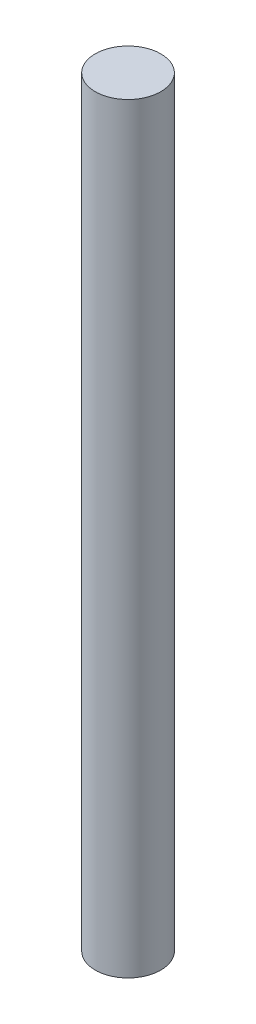
ISO-10303-21;
HEADER;
FILE_DESCRIPTION(('STEP AP214'),'2;1');
FILE_NAME('part.step','',(''),(''),'','','');
FILE_SCHEMA(('AUTOMOTIVE_DESIGN { 1 0 10303 214 1 1 1 1 }'));
ENDSEC;
DATA;
#1=APPLICATION_CONTEXT('core data for automotive mechanical design processes');
#2=APPLICATION_PROTOCOL_DEFINITION('international standard','automotive_design',2000,#1);
#3=PRODUCT_CONTEXT('',#1,'mechanical');
#4=PRODUCT('Part','Part','',(#3));
#5=PRODUCT_RELATED_PRODUCT_CATEGORY('part','',(#4));
#6=PRODUCT_DEFINITION_FORMATION('','',#4);
#7=PRODUCT_DEFINITION_CONTEXT('part definition',#1,'design');
#8=PRODUCT_DEFINITION('design','',#6,#7);
#9=PRODUCT_DEFINITION_SHAPE('','',#8);
#10=(LENGTH_UNIT() NAMED_UNIT(*) SI_UNIT(.MILLI.,.METRE.));
#11=(NAMED_UNIT(*) PLANE_ANGLE_UNIT() SI_UNIT($,.RADIAN.));
#12=(NAMED_UNIT(*) SI_UNIT($,.STERADIAN.) SOLID_ANGLE_UNIT());
#13=UNCERTAINTY_MEASURE_WITH_UNIT(LENGTH_MEASURE(1.E-05),#10,'distance_accuracy_value','');
#14=(GEOMETRIC_REPRESENTATION_CONTEXT(3) GLOBAL_UNCERTAINTY_ASSIGNED_CONTEXT((#13)) GLOBAL_UNIT_ASSIGNED_CONTEXT((#10,
#11,#12)) REPRESENTATION_CONTEXT('',''));
#15=CARTESIAN_POINT('',(0.,0.,0.));
#16=DIRECTION('',(0.,0.,1.));
#17=DIRECTION('',(1.,0.,0.));
#18=AXIS2_PLACEMENT_3D('',#15,#16,#17);
#19=CARTESIAN_POINT('',(0.,58.,0.));
#20=DIRECTION('',(0.,-1.,0.));
#21=DIRECTION('',(0.,0.,-1.));
#22=AXIS2_PLACEMENT_3D('',#19,#20,#21);
#23=CYLINDRICAL_SURFACE('',#22,2.5);
#24=CARTESIAN_POINT('',(0.,58.,0.));
#25=DIRECTION('',(0.,1.,0.));
#26=DIRECTION('',(0.,0.,1.));
#27=AXIS2_PLACEMENT_3D('',#24,#25,#26);
#28=CIRCLE('',#27,2.5);
#29=CARTESIAN_POINT('',(0.,58.,-2.5));
#30=VERTEX_POINT('',#29);
#31=EDGE_CURVE('E10',#30,#30,#28,.T.);
#32=CARTESIAN_POINT('',(0.,0.,0.));
#33=DIRECTION('',(0.,1.,0.));
#34=DIRECTION('',(0.,0.,1.));
#35=AXIS2_PLACEMENT_3D('',#32,#33,#34);
#36=CIRCLE('',#35,2.5);
#37=CARTESIAN_POINT('',(0.,0.,-2.5));
#38=VERTEX_POINT('',#37);
#39=EDGE_CURVE('E34',#38,#38,#36,.T.);
#40=CARTESIAN_POINT('',(0.,58.,-2.5));
#41=CARTESIAN_POINT('',(0.,57.3958333333333,-2.5));
#42=CARTESIAN_POINT('',(0.,56.7916666666667,-2.5));
#43=CARTESIAN_POINT('',(0.,55.5833333333333,-2.5));
#44=CARTESIAN_POINT('',(0.,54.9791666666667,-2.5));
#45=CARTESIAN_POINT('',(0.,53.7708333333333,-2.5));
#46=CARTESIAN_POINT('',(0.,53.1666666666667,-2.5));
#47=CARTESIAN_POINT('',(0.,51.9583333333333,-2.5));
#48=CARTESIAN_POINT('',(0.,51.3541666666667,-2.5));
#49=CARTESIAN_POINT('',(0.,50.1458333333333,-2.5));
#50=CARTESIAN_POINT('',(0.,49.5416666666667,-2.5));
#51=CARTESIAN_POINT('',(0.,48.3333333333333,-2.5));
#52=CARTESIAN_POINT('',(0.,47.7291666666667,-2.5));
#53=CARTESIAN_POINT('',(0.,46.5208333333333,-2.5));
#54=CARTESIAN_POINT('',(0.,45.9166666666667,-2.5));
#55=CARTESIAN_POINT('',(0.,44.7083333333333,-2.5));
#56=CARTESIAN_POINT('',(0.,44.1041666666667,-2.5));
#57=CARTESIAN_POINT('',(0.,42.8958333333333,-2.5));
#58=CARTESIAN_POINT('',(0.,42.2916666666667,-2.5));
#59=CARTESIAN_POINT('',(0.,41.0833333333333,-2.5));
#60=CARTESIAN_POINT('',(0.,40.4791666666667,-2.5));
#61=CARTESIAN_POINT('',(0.,39.2708333333333,-2.5));
#62=CARTESIAN_POINT('',(0.,38.6666666666667,-2.5));
#63=CARTESIAN_POINT('',(0.,37.4583333333333,-2.5));
#64=CARTESIAN_POINT('',(0.,36.8541666666667,-2.5));
#65=CARTESIAN_POINT('',(0.,35.6458333333333,-2.5));
#66=CARTESIAN_POINT('',(0.,35.0416666666667,-2.5));
#67=CARTESIAN_POINT('',(0.,33.8333333333333,-2.5));
#68=CARTESIAN_POINT('',(0.,33.2291666666667,-2.5));
#69=CARTESIAN_POINT('',(0.,32.0208333333333,-2.5));
#70=CARTESIAN_POINT('',(0.,31.4166666666667,-2.5));
#71=CARTESIAN_POINT('',(0.,30.2083333333333,-2.5));
#72=CARTESIAN_POINT('',(0.,29.6041666666667,-2.5));
#73=CARTESIAN_POINT('',(0.,28.3958333333333,-2.5));
#74=CARTESIAN_POINT('',(0.,27.7916666666667,-2.5));
#75=CARTESIAN_POINT('',(0.,26.5833333333333,-2.5));
#76=CARTESIAN_POINT('',(0.,25.9791666666667,-2.5));
#77=CARTESIAN_POINT('',(0.,24.7708333333333,-2.5));
#78=CARTESIAN_POINT('',(0.,24.1666666666667,-2.5));
#79=CARTESIAN_POINT('',(0.,22.9583333333333,-2.5));
#80=CARTESIAN_POINT('',(0.,22.3541666666667,-2.5));
#81=CARTESIAN_POINT('',(0.,21.1458333333333,-2.5));
#82=CARTESIAN_POINT('',(0.,20.5416666666667,-2.5));
#83=CARTESIAN_POINT('',(0.,19.3333333333333,-2.5));
#84=CARTESIAN_POINT('',(0.,18.7291666666667,-2.5));
#85=CARTESIAN_POINT('',(0.,17.5208333333333,-2.5));
#86=CARTESIAN_POINT('',(0.,16.9166666666667,-2.5));
#87=CARTESIAN_POINT('',(0.,15.7083333333333,-2.5));
#88=CARTESIAN_POINT('',(0.,15.1041666666667,-2.5));
#89=CARTESIAN_POINT('',(0.,13.8958333333333,-2.5));
#90=CARTESIAN_POINT('',(0.,13.2916666666667,-2.5));
#91=CARTESIAN_POINT('',(0.,12.0833333333333,-2.5));
#92=CARTESIAN_POINT('',(0.,11.4791666666667,-2.5));
#93=CARTESIAN_POINT('',(0.,10.2708333333333,-2.5));
#94=CARTESIAN_POINT('',(0.,9.66666666666667,-2.5));
#95=CARTESIAN_POINT('',(0.,8.45833333333333,-2.5));
#96=CARTESIAN_POINT('',(0.,7.85416666666667,-2.5));
#97=CARTESIAN_POINT('',(0.,6.64583333333333,-2.5));
#98=CARTESIAN_POINT('',(0.,6.04166666666667,-2.5));
#99=CARTESIAN_POINT('',(0.,4.83333333333333,-2.5));
#100=CARTESIAN_POINT('',(0.,4.22916666666667,-2.5));
#101=CARTESIAN_POINT('',(0.,3.02083333333334,-2.5));
#102=CARTESIAN_POINT('',(0.,2.41666666666667,-2.5));
#103=CARTESIAN_POINT('',(0.,1.20833333333333,-2.5));
#104=CARTESIAN_POINT('',(0.,0.604166666666666,-2.5));
#105=CARTESIAN_POINT('',(0.,0.,-2.5));
#106=B_SPLINE_CURVE_WITH_KNOTS('',3,(#40,#41,#42,#43,#44,#45,#46,#47,#48,#49,#50,#51,#52,#53,
#54,#55,#56,#57,#58,#59,#60,#61,#62,#63,#64,#65,#66,#67,#68,#69,#70,#71,#72,#73,#74,#75,#76,#77,
#78,#79,#80,#81,#82,#83,#84,#85,#86,#87,#88,#89,#90,#91,#92,#93,#94,#95,#96,#97,#98,#99,#100,
#101,#102,#103,#104,#105),.UNSPECIFIED.,.F.,.F.,(4,2,2,2,2,2,2,2,2,2,2,2,2,2,2,2,2,2,2,2,2,2,2,
2,2,2,2,2,2,2,2,2,4),(0.,1.81249999999999,3.625,5.4375,7.24999999999999,9.06249999999999,10.875,
12.6875,14.5,16.3125,18.125,19.9375,21.75,23.5625,25.375,27.1875,29.,30.8125,32.625,34.4375,
36.25,38.0625,39.875,41.6875,43.5,45.3125,47.125,48.9375,50.75,52.5625,54.375,56.1875,58.),.UNSPECIFIED.);
#107=EDGE_CURVE('BSEAM31',#30,#38,#106,.T.);
#108=ORIENTED_EDGE('',*,*,#31,.F.);
#109=ORIENTED_EDGE('',*,*,#39,.T.);
#110=ORIENTED_EDGE('',*,*,#107,.T.);
#111=ORIENTED_EDGE('',*,*,#107,.F.);
#112=EDGE_LOOP('',(#108,#110,#109,#111));
#113=FACE_BOUND('',#112,.T.);
#114=ADVANCED_FACE('F31',(#113),#23,.T.);
#115=CARTESIAN_POINT('',(0.,58.,0.));
#116=DIRECTION('',(0.,1.,0.));
#117=DIRECTION('',(0.,0.,1.));
#118=AXIS2_PLACEMENT_3D('',#115,#116,#117);
#119=PLANE('',#118);
#120=ORIENTED_EDGE('',*,*,#31,.T.);
#121=EDGE_LOOP('',(#120));
#122=FACE_BOUND('',#121,.T.);
#123=ADVANCED_FACE('F46',(#122),#119,.T.);
#124=CARTESIAN_POINT('',(0.,0.,0.));
#125=DIRECTION('',(0.,1.,0.));
#126=DIRECTION('',(0.,0.,1.));
#127=AXIS2_PLACEMENT_3D('',#124,#125,#126);
#128=PLANE('',#127);
#129=ORIENTED_EDGE('',*,*,#39,.F.);
#130=EDGE_LOOP('',(#129));
#131=FACE_BOUND('',#130,.T.);
#132=ADVANCED_FACE('F44',(#131),#128,.F.);
#133=CLOSED_SHELL('',(#114,#123,#132));
#134=MANIFOLD_SOLID_BREP('B2',#133);
#135=ADVANCED_BREP_SHAPE_REPRESENTATION('',(#18,#134),#14);
#136=SHAPE_DEFINITION_REPRESENTATION(#9,#135);
ENDSEC;
END-ISO-10303-21;
